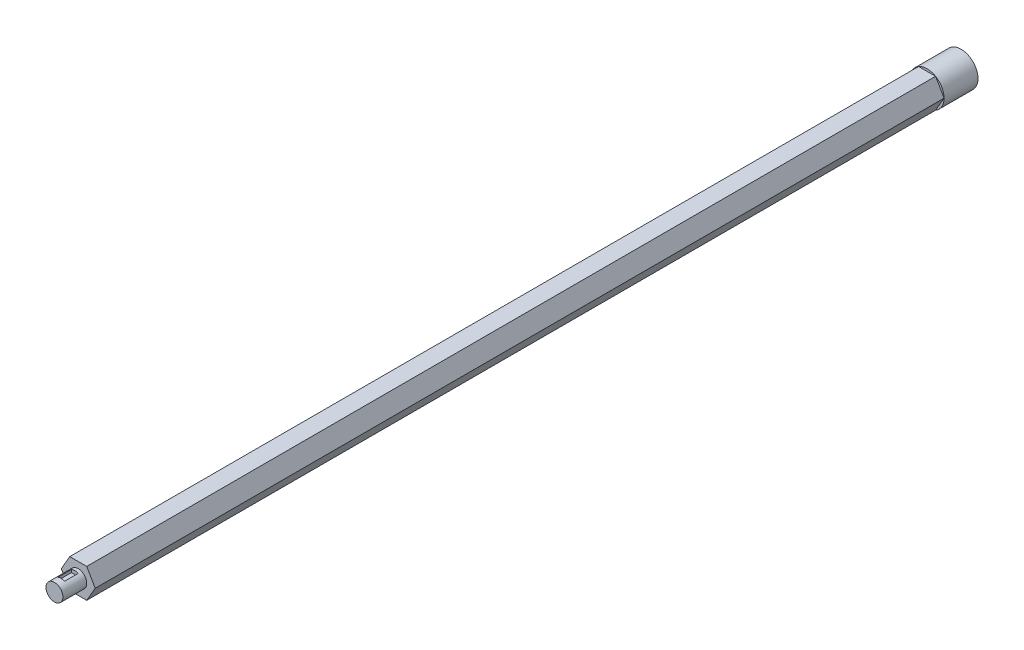
ISO-10303-21;
HEADER;
FILE_DESCRIPTION(('STEP AP214'),'2;1');
FILE_NAME('part.step','',(''),(''),'','','');
FILE_SCHEMA(('AUTOMOTIVE_DESIGN { 1 0 10303 214 1 1 1 1 }'));
ENDSEC;
DATA;
#1=APPLICATION_CONTEXT('core data for automotive mechanical design processes');
#2=APPLICATION_PROTOCOL_DEFINITION('international standard','automotive_design',2000,#1);
#3=PRODUCT_CONTEXT('',#1,'mechanical');
#4=PRODUCT('Part','Part','',(#3));
#5=PRODUCT_RELATED_PRODUCT_CATEGORY('part','',(#4));
#6=PRODUCT_DEFINITION_FORMATION('','',#4);
#7=PRODUCT_DEFINITION_CONTEXT('part definition',#1,'design');
#8=PRODUCT_DEFINITION('design','',#6,#7);
#9=PRODUCT_DEFINITION_SHAPE('','',#8);
#10=(LENGTH_UNIT() NAMED_UNIT(*) SI_UNIT(.MILLI.,.METRE.));
#11=(NAMED_UNIT(*) PLANE_ANGLE_UNIT() SI_UNIT($,.RADIAN.));
#12=(NAMED_UNIT(*) SI_UNIT($,.STERADIAN.) SOLID_ANGLE_UNIT());
#13=UNCERTAINTY_MEASURE_WITH_UNIT(LENGTH_MEASURE(1.E-05),#10,'distance_accuracy_value','');
#14=(GEOMETRIC_REPRESENTATION_CONTEXT(3) GLOBAL_UNCERTAINTY_ASSIGNED_CONTEXT((#13)) GLOBAL_UNIT_ASSIGNED_CONTEXT((#10,
#11,#12)) REPRESENTATION_CONTEXT('',''));
#15=CARTESIAN_POINT('',(0.,0.,0.));
#16=DIRECTION('',(0.,0.,1.));
#17=DIRECTION('',(1.,0.,0.));
#18=AXIS2_PLACEMENT_3D('',#15,#16,#17);
#19=CARTESIAN_POINT('',(0.,0.,250.));
#20=DIRECTION('',(0.,0.,1.));
#21=DIRECTION('',(1.,0.,0.));
#22=AXIS2_PLACEMENT_3D('',#19,#20,#21);
#23=PLANE('',#22);
#24=DIRECTION('',(0.5,0.866025403784439,0.));
#25=VECTOR('',#24,1.);
#26=CARTESIAN_POINT('',(2.5,-4.33012701892219,250.));
#27=LINE('',#26,#25);
#28=CARTESIAN_POINT('',(2.5,-4.33012701892219,250.));
#29=VERTEX_POINT('',#28);
#30=CARTESIAN_POINT('',(5.,0.,250.));
#31=VERTEX_POINT('',#30);
#32=EDGE_CURVE('E147',#29,#31,#27,.T.);
#33=ORIENTED_EDGE('',*,*,#32,.T.);
#34=DIRECTION('',(-0.5,0.866025403784439,0.));
#35=VECTOR('',#34,1.);
#36=CARTESIAN_POINT('',(5.,0.,250.));
#37=LINE('',#36,#35);
#38=CARTESIAN_POINT('',(2.5,4.33012701892219,250.));
#39=VERTEX_POINT('',#38);
#40=EDGE_CURVE('E150',#31,#39,#37,.T.);
#41=ORIENTED_EDGE('',*,*,#40,.T.);
#42=DIRECTION('',(-1.,0.,0.));
#43=VECTOR('',#42,1.);
#44=CARTESIAN_POINT('',(2.5,4.33012701892219,250.));
#45=LINE('',#44,#43);
#46=CARTESIAN_POINT('',(-2.5,4.33012701892219,250.));
#47=VERTEX_POINT('',#46);
#48=EDGE_CURVE('E153',#39,#47,#45,.T.);
#49=ORIENTED_EDGE('',*,*,#48,.T.);
#50=DIRECTION('',(-0.5,-0.866025403784439,0.));
#51=VECTOR('',#50,1.);
#52=CARTESIAN_POINT('',(-2.5,4.33012701892219,250.));
#53=LINE('',#52,#51);
#54=CARTESIAN_POINT('',(-5.,0.,250.));
#55=VERTEX_POINT('',#54);
#56=EDGE_CURVE('E155',#47,#55,#53,.T.);
#57=ORIENTED_EDGE('',*,*,#56,.T.);
#58=DIRECTION('',(0.5,-0.866025403784439,0.));
#59=VECTOR('',#58,1.);
#60=CARTESIAN_POINT('',(-5.,0.,250.));
#61=LINE('',#60,#59);
#62=CARTESIAN_POINT('',(-2.5,-4.33012701892219,250.));
#63=VERTEX_POINT('',#62);
#64=EDGE_CURVE('E157',#55,#63,#61,.T.);
#65=ORIENTED_EDGE('',*,*,#64,.T.);
#66=DIRECTION('',(1.,0.,0.));
#67=VECTOR('',#66,1.);
#68=CARTESIAN_POINT('',(-2.5,-4.33012701892219,250.));
#69=LINE('',#68,#67);
#70=EDGE_CURVE('E159',#63,#29,#69,.T.);
#71=ORIENTED_EDGE('',*,*,#70,.T.);
#72=EDGE_LOOP('',(#33,#41,#49,#57,#65,#71));
#73=FACE_BOUND('',#72,.T.);
#74=CARTESIAN_POINT('',(0.,0.,250.));
#75=DIRECTION('',(0.,0.,1.));
#76=DIRECTION('',(1.,0.,0.));
#77=AXIS2_PLACEMENT_3D('',#74,#75,#76);
#78=CIRCLE('',#77,2.5);
#79=CARTESIAN_POINT('',(2.5,0.,250.));
#80=VERTEX_POINT('',#79);
#81=EDGE_CURVE('E143',#80,#80,#78,.T.);
#82=ORIENTED_EDGE('',*,*,#81,.F.);
#83=EDGE_LOOP('',(#82));
#84=FACE_BOUND('',#83,.T.);
#85=ADVANCED_FACE('F33',(#73,#84),#23,.T.);
#86=CARTESIAN_POINT('',(0.,0.,260.));
#87=DIRECTION('',(0.,0.,-1.));
#88=DIRECTION('',(-1.,0.,0.));
#89=AXIS2_PLACEMENT_3D('',#86,#87,#88);
#90=CYLINDRICAL_SURFACE('',#89,2.5);
#91=DIRECTION('',(0.,0.,-1.));
#92=VECTOR('',#91,1.);
#93=CARTESIAN_POINT('',(-1.,2.29128784747792,260.));
#94=LINE('',#93,#92);
#95=CARTESIAN_POINT('',(-1.,2.29128784747792,255.));
#96=VERTEX_POINT('',#95);
#97=CARTESIAN_POINT('',(-1.,2.29128784747792,251.));
#98=VERTEX_POINT('',#97);
#99=EDGE_CURVE('E48',#96,#98,#94,.T.);
#100=ORIENTED_EDGE('',*,*,#99,.T.);
#101=CARTESIAN_POINT('',(0.,0.,251.));
#102=DIRECTION('',(0.,0.,1.));
#103=DIRECTION('',(1.,0.,0.));
#104=AXIS2_PLACEMENT_3D('',#101,#102,#103);
#105=CIRCLE('',#104,2.5);
#106=CARTESIAN_POINT('',(1.,2.29128784747792,251.));
#107=VERTEX_POINT('',#106);
#108=EDGE_CURVE('E115',#107,#98,#105,.T.);
#109=ORIENTED_EDGE('',*,*,#108,.F.);
#110=DIRECTION('',(0.,0.,-1.));
#111=VECTOR('',#110,1.);
#112=CARTESIAN_POINT('',(1.,2.29128784747792,260.));
#113=LINE('',#112,#111);
#114=CARTESIAN_POINT('',(1.,2.29128784747792,255.));
#115=VERTEX_POINT('',#114);
#116=EDGE_CURVE('E56',#107,#115,#113,.F.);
#117=ORIENTED_EDGE('',*,*,#116,.T.);
#118=CARTESIAN_POINT('',(0.,0.,255.));
#119=DIRECTION('',(0.,0.,1.));
#120=DIRECTION('',(1.,0.,0.));
#121=AXIS2_PLACEMENT_3D('',#118,#119,#120);
#122=CIRCLE('',#121,2.5);
#123=EDGE_CURVE('E203',#115,#96,#122,.T.);
#124=ORIENTED_EDGE('',*,*,#123,.T.);
#125=EDGE_LOOP('',(#100,#109,#117,#124));
#126=FACE_BOUND('',#125,.T.);
#127=CARTESIAN_POINT('',(0.,0.,257.));
#128=DIRECTION('',(0.,0.,1.));
#129=DIRECTION('',(1.,0.,0.));
#130=AXIS2_PLACEMENT_3D('',#127,#128,#129);
#131=CIRCLE('',#130,2.5);
#132=CARTESIAN_POINT('',(2.5,0.,257.));
#133=VERTEX_POINT('',#132);
#134=EDGE_CURVE('E207',#133,#133,#131,.T.);
#135=ORIENTED_EDGE('',*,*,#134,.F.);
#136=EDGE_LOOP('',(#135));
#137=FACE_BOUND('',#136,.T.);
#138=ORIENTED_EDGE('',*,*,#81,.T.);
#139=EDGE_LOOP('',(#138));
#140=FACE_BOUND('',#139,.T.);
#141=ADVANCED_FACE('F120',(#126,#137,#140),#90,.T.);
#142=CARTESIAN_POINT('',(-1.,3.33557361442027,250.));
#143=DIRECTION('',(-1.,0.,0.));
#144=DIRECTION('',(0.,-1.,0.));
#145=AXIS2_PLACEMENT_3D('',#142,#143,#144);
#146=PLANE('',#145);
#147=DIRECTION('',(0.,0.,1.));
#148=VECTOR('',#147,1.);
#149=CARTESIAN_POINT('',(-1.,1.5,250.));
#150=LINE('',#149,#148);
#151=CARTESIAN_POINT('',(-1.,1.5,251.));
#152=VERTEX_POINT('',#151);
#153=CARTESIAN_POINT('',(-1.,1.5,255.));
#154=VERTEX_POINT('',#153);
#155=EDGE_CURVE('E131',#152,#154,#150,.T.);
#156=ORIENTED_EDGE('',*,*,#155,.F.);
#157=DIRECTION('',(0.,1.,0.));
#158=VECTOR('',#157,1.);
#159=CARTESIAN_POINT('',(-1.,3.33557361442027,251.));
#160=LINE('',#159,#158);
#161=EDGE_CURVE('E118',#152,#98,#160,.T.);
#162=ORIENTED_EDGE('',*,*,#161,.T.);
#163=ORIENTED_EDGE('',*,*,#99,.F.);
#164=DIRECTION('',(0.,1.,0.));
#165=VECTOR('',#164,1.);
#166=CARTESIAN_POINT('',(-1.,3.33557361442027,255.));
#167=LINE('',#166,#165);
#168=EDGE_CURVE('E197',#154,#96,#167,.T.);
#169=ORIENTED_EDGE('',*,*,#168,.F.);
#170=EDGE_LOOP('',(#156,#162,#163,#169));
#171=FACE_BOUND('',#170,.T.);
#172=ADVANCED_FACE('F201',(#171),#146,.F.);
#173=CARTESIAN_POINT('',(1.,3.33557361442027,250.));
#174=DIRECTION('',(1.,0.,0.));
#175=DIRECTION('',(0.,1.,0.));
#176=AXIS2_PLACEMENT_3D('',#173,#174,#175);
#177=PLANE('',#176);
#178=ORIENTED_EDGE('',*,*,#116,.F.);
#179=DIRECTION('',(0.,-1.,0.));
#180=VECTOR('',#179,1.);
#181=CARTESIAN_POINT('',(1.,3.33557361442027,251.));
#182=LINE('',#181,#180);
#183=CARTESIAN_POINT('',(1.,1.5,251.));
#184=VERTEX_POINT('',#183);
#185=EDGE_CURVE('E113',#107,#184,#182,.T.);
#186=ORIENTED_EDGE('',*,*,#185,.T.);
#187=DIRECTION('',(0.,0.,1.));
#188=VECTOR('',#187,1.);
#189=CARTESIAN_POINT('',(1.,1.5,250.));
#190=LINE('',#189,#188);
#191=CARTESIAN_POINT('',(1.,1.5,255.));
#192=VERTEX_POINT('',#191);
#193=EDGE_CURVE('E127',#184,#192,#190,.T.);
#194=ORIENTED_EDGE('',*,*,#193,.T.);
#195=DIRECTION('',(0.,-1.,0.));
#196=VECTOR('',#195,1.);
#197=CARTESIAN_POINT('',(1.,3.33557361442027,255.));
#198=LINE('',#197,#196);
#199=EDGE_CURVE('E125',#115,#192,#198,.T.);
#200=ORIENTED_EDGE('',*,*,#199,.F.);
#201=EDGE_LOOP('',(#178,#186,#194,#200));
#202=FACE_BOUND('',#201,.T.);
#203=ADVANCED_FACE('F123',(#202),#177,.F.);
#204=CARTESIAN_POINT('',(-1.,1.5,250.));
#205=DIRECTION('',(0.,-1.,0.));
#206=DIRECTION('',(0.,0.,-1.));
#207=AXIS2_PLACEMENT_3D('',#204,#205,#206);
#208=PLANE('',#207);
#209=ORIENTED_EDGE('',*,*,#193,.F.);
#210=DIRECTION('',(-1.,0.,0.));
#211=VECTOR('',#210,1.);
#212=CARTESIAN_POINT('',(-1.,1.5,251.));
#213=LINE('',#212,#211);
#214=EDGE_CURVE('E11',#184,#152,#213,.T.);
#215=ORIENTED_EDGE('',*,*,#214,.T.);
#216=ORIENTED_EDGE('',*,*,#155,.T.);
#217=DIRECTION('',(-1.,0.,0.));
#218=VECTOR('',#217,1.);
#219=CARTESIAN_POINT('',(-1.,1.5,255.));
#220=LINE('',#219,#218);
#221=EDGE_CURVE('E41',#192,#154,#220,.T.);
#222=ORIENTED_EDGE('',*,*,#221,.F.);
#223=EDGE_LOOP('',(#209,#215,#216,#222));
#224=FACE_BOUND('',#223,.T.);
#225=ADVANCED_FACE('F199',(#224),#208,.F.);
#226=CARTESIAN_POINT('',(2.5,-4.33012701892219,250.));
#227=DIRECTION('',(-0.866025403784439,0.5,0.));
#228=DIRECTION('',(-0.5,-0.866025403784439,0.));
#229=AXIS2_PLACEMENT_3D('',#226,#227,#228);
#230=PLANE('',#229);
#231=DIRECTION('',(0.5,0.866025403784439,0.));
#232=VECTOR('',#231,1.);
#233=CARTESIAN_POINT('',(2.5,-4.33012701892219,0.));
#234=LINE('',#233,#232);
#235=CARTESIAN_POINT('',(2.50000000000001,-4.33012701892219,0.));
#236=VERTEX_POINT('',#235);
#237=CARTESIAN_POINT('',(5.,0.,0.));
#238=VERTEX_POINT('',#237);
#239=EDGE_CURVE('E138',#236,#238,#234,.T.);
#240=ORIENTED_EDGE('',*,*,#239,.T.);
#241=DIRECTION('',(0.,0.,-1.));
#242=VECTOR('',#241,1.);
#243=CARTESIAN_POINT('',(5.,0.,250.));
#244=LINE('',#243,#242);
#245=EDGE_CURVE('E146',#31,#238,#244,.T.);
#246=ORIENTED_EDGE('',*,*,#245,.F.);
#247=ORIENTED_EDGE('',*,*,#32,.F.);
#248=DIRECTION('',(0.,0.,-1.));
#249=VECTOR('',#248,1.);
#250=CARTESIAN_POINT('',(2.5,-4.33012701892219,250.));
#251=LINE('',#250,#249);
#252=EDGE_CURVE('E161',#29,#236,#251,.T.);
#253=ORIENTED_EDGE('',*,*,#252,.T.);
#254=EDGE_LOOP('',(#240,#246,#247,#253));
#255=FACE_BOUND('',#254,.T.);
#256=ADVANCED_FACE('F35',(#255),#230,.F.);
#257=CARTESIAN_POINT('',(5.,0.,250.));
#258=DIRECTION('',(-0.866025403784439,-0.5,0.));
#259=DIRECTION('',(0.5,-0.866025403784439,0.));
#260=AXIS2_PLACEMENT_3D('',#257,#258,#259);
#261=PLANE('',#260);
#262=DIRECTION('',(-0.5,0.866025403784439,0.));
#263=VECTOR('',#262,1.);
#264=CARTESIAN_POINT('',(5.,0.,0.));
#265=LINE('',#264,#263);
#266=CARTESIAN_POINT('',(2.5,4.33012701892219,0.));
#267=VERTEX_POINT('',#266);
#268=EDGE_CURVE('E164',#238,#267,#265,.T.);
#269=ORIENTED_EDGE('',*,*,#268,.T.);
#270=DIRECTION('',(0.,0.,-1.));
#271=VECTOR('',#270,1.);
#272=CARTESIAN_POINT('',(2.5,4.33012701892219,250.));
#273=LINE('',#272,#271);
#274=EDGE_CURVE('E189',#39,#267,#273,.T.);
#275=ORIENTED_EDGE('',*,*,#274,.F.);
#276=ORIENTED_EDGE('',*,*,#40,.F.);
#277=ORIENTED_EDGE('',*,*,#245,.T.);
#278=EDGE_LOOP('',(#269,#275,#276,#277));
#279=FACE_BOUND('',#278,.T.);
#280=ADVANCED_FACE('F240',(#279),#261,.F.);
#281=CARTESIAN_POINT('',(2.5,4.33012701892219,250.));
#282=DIRECTION('',(0.,-1.,0.));
#283=DIRECTION('',(1.,0.,0.));
#284=AXIS2_PLACEMENT_3D('',#281,#282,#283);
#285=PLANE('',#284);
#286=DIRECTION('',(-1.,0.,0.));
#287=VECTOR('',#286,1.);
#288=CARTESIAN_POINT('',(2.5,4.33012701892219,0.));
#289=LINE('',#288,#287);
#290=CARTESIAN_POINT('',(-2.5,4.33012701892219,0.));
#291=VERTEX_POINT('',#290);
#292=EDGE_CURVE('E167',#267,#291,#289,.T.);
#293=ORIENTED_EDGE('',*,*,#292,.T.);
#294=DIRECTION('',(0.,0.,-1.));
#295=VECTOR('',#294,1.);
#296=CARTESIAN_POINT('',(-2.5,4.33012701892219,250.));
#297=LINE('',#296,#295);
#298=EDGE_CURVE('E186',#47,#291,#297,.T.);
#299=ORIENTED_EDGE('',*,*,#298,.F.);
#300=ORIENTED_EDGE('',*,*,#48,.F.);
#301=ORIENTED_EDGE('',*,*,#274,.T.);
#302=EDGE_LOOP('',(#293,#299,#300,#301));
#303=FACE_BOUND('',#302,.T.);
#304=ADVANCED_FACE('F237',(#303),#285,.F.);
#305=CARTESIAN_POINT('',(-2.5,4.33012701892219,250.));
#306=DIRECTION('',(0.866025403784439,-0.5,0.));
#307=DIRECTION('',(0.5,0.866025403784439,0.));
#308=AXIS2_PLACEMENT_3D('',#305,#306,#307);
#309=PLANE('',#308);
#310=DIRECTION('',(-0.5,-0.866025403784439,0.));
#311=VECTOR('',#310,1.);
#312=CARTESIAN_POINT('',(-2.5,4.33012701892219,0.));
#313=LINE('',#312,#311);
#314=CARTESIAN_POINT('',(-5.,0.,0.));
#315=VERTEX_POINT('',#314);
#316=EDGE_CURVE('E170',#291,#315,#313,.T.);
#317=ORIENTED_EDGE('',*,*,#316,.T.);
#318=DIRECTION('',(0.,0.,-1.));
#319=VECTOR('',#318,1.);
#320=CARTESIAN_POINT('',(-5.,0.,250.));
#321=LINE('',#320,#319);
#322=EDGE_CURVE('E183',#55,#315,#321,.T.);
#323=ORIENTED_EDGE('',*,*,#322,.F.);
#324=ORIENTED_EDGE('',*,*,#56,.F.);
#325=ORIENTED_EDGE('',*,*,#298,.T.);
#326=EDGE_LOOP('',(#317,#323,#324,#325));
#327=FACE_BOUND('',#326,.T.);
#328=ADVANCED_FACE('F233',(#327),#309,.F.);
#329=CARTESIAN_POINT('',(-5.,0.,250.));
#330=DIRECTION('',(0.866025403784439,0.5,0.));
#331=DIRECTION('',(-0.5,0.866025403784439,0.));
#332=AXIS2_PLACEMENT_3D('',#329,#330,#331);
#333=PLANE('',#332);
#334=DIRECTION('',(0.5,-0.866025403784439,0.));
#335=VECTOR('',#334,1.);
#336=CARTESIAN_POINT('',(-5.,0.,0.));
#337=LINE('',#336,#335);
#338=CARTESIAN_POINT('',(-2.50000000000001,-4.33012701892219,0.));
#339=VERTEX_POINT('',#338);
#340=EDGE_CURVE('E173',#315,#339,#337,.T.);
#341=ORIENTED_EDGE('',*,*,#340,.T.);
#342=DIRECTION('',(0.,0.,-1.));
#343=VECTOR('',#342,1.);
#344=CARTESIAN_POINT('',(-2.5,-4.33012701892219,250.));
#345=LINE('',#344,#343);
#346=EDGE_CURVE('E180',#63,#339,#345,.T.);
#347=ORIENTED_EDGE('',*,*,#346,.F.);
#348=ORIENTED_EDGE('',*,*,#64,.F.);
#349=ORIENTED_EDGE('',*,*,#322,.T.);
#350=EDGE_LOOP('',(#341,#347,#348,#349));
#351=FACE_BOUND('',#350,.T.);
#352=ADVANCED_FACE('F229',(#351),#333,.F.);
#353=CARTESIAN_POINT('',(-2.5,-4.33012701892219,250.));
#354=DIRECTION('',(0.,1.,0.));
#355=DIRECTION('',(-1.,0.,0.));
#356=AXIS2_PLACEMENT_3D('',#353,#354,#355);
#357=PLANE('',#356);
#358=DIRECTION('',(1.,0.,0.));
#359=VECTOR('',#358,1.);
#360=CARTESIAN_POINT('',(-2.5,-4.33012701892219,0.));
#361=LINE('',#360,#359);
#362=EDGE_CURVE('E151',#339,#236,#361,.T.);
#363=ORIENTED_EDGE('',*,*,#362,.T.);
#364=ORIENTED_EDGE('',*,*,#252,.F.);
#365=ORIENTED_EDGE('',*,*,#70,.F.);
#366=ORIENTED_EDGE('',*,*,#346,.T.);
#367=EDGE_LOOP('',(#363,#364,#365,#366));
#368=FACE_BOUND('',#367,.T.);
#369=ADVANCED_FACE('F225',(#368),#357,.F.);
#370=CARTESIAN_POINT('',(0.,0.,0.));
#371=DIRECTION('',(0.,0.,-1.));
#372=DIRECTION('',(-1.,0.,0.));
#373=AXIS2_PLACEMENT_3D('',#370,#371,#372);
#374=PLANE('',#373);
#375=ORIENTED_EDGE('',*,*,#239,.F.);
#376=CARTESIAN_POINT('',(0.,0.,0.));
#377=DIRECTION('',(0.,0.,-1.));
#378=DIRECTION('',(-1.,0.,0.));
#379=AXIS2_PLACEMENT_3D('',#376,#377,#378);
#380=CIRCLE('',#379,5.);
#381=EDGE_CURVE('E264',#238,#236,#380,.T.);
#382=ORIENTED_EDGE('',*,*,#381,.F.);
#383=EDGE_LOOP('',(#375,#382));
#384=FACE_BOUND('',#383,.T.);
#385=ADVANCED_FACE('F228',(#384),#374,.F.);
#386=ORIENTED_EDGE('',*,*,#362,.F.);
#387=EDGE_CURVE('E268',#236,#339,#380,.T.);
#388=ORIENTED_EDGE('',*,*,#387,.F.);
#389=EDGE_LOOP('',(#386,#388));
#390=FACE_BOUND('',#389,.T.);
#391=ADVANCED_FACE('F269',(#390),#374,.F.);
#392=ORIENTED_EDGE('',*,*,#340,.F.);
#393=EDGE_CURVE('E129',#339,#315,#380,.T.);
#394=ORIENTED_EDGE('',*,*,#393,.F.);
#395=EDGE_LOOP('',(#392,#394));
#396=FACE_BOUND('',#395,.T.);
#397=ADVANCED_FACE('F278',(#396),#374,.F.);
#398=ORIENTED_EDGE('',*,*,#316,.F.);
#399=EDGE_CURVE('E139',#315,#291,#380,.T.);
#400=ORIENTED_EDGE('',*,*,#399,.F.);
#401=EDGE_LOOP('',(#398,#400));
#402=FACE_BOUND('',#401,.T.);
#403=ADVANCED_FACE('F281',(#402),#374,.F.);
#404=ORIENTED_EDGE('',*,*,#292,.F.);
#405=EDGE_CURVE('E142',#291,#267,#380,.T.);
#406=ORIENTED_EDGE('',*,*,#405,.F.);
#407=EDGE_LOOP('',(#404,#406));
#408=FACE_BOUND('',#407,.T.);
#409=ADVANCED_FACE('F284',(#408),#374,.F.);
#410=ORIENTED_EDGE('',*,*,#268,.F.);
#411=EDGE_CURVE('E274',#267,#238,#380,.T.);
#412=ORIENTED_EDGE('',*,*,#411,.F.);
#413=EDGE_LOOP('',(#410,#412));
#414=FACE_BOUND('',#413,.T.);
#415=ADVANCED_FACE('F285',(#414),#374,.F.);
#416=CARTESIAN_POINT('',(0.,0.,-10.));
#417=DIRECTION('',(0.,0.,1.));
#418=DIRECTION('',(1.,0.,0.));
#419=AXIS2_PLACEMENT_3D('',#416,#417,#418);
#420=CYLINDRICAL_SURFACE('',#419,5.);
#421=CARTESIAN_POINT('',(0.,0.,-10.));
#422=DIRECTION('',(0.,0.,-1.));
#423=DIRECTION('',(-1.,0.,0.));
#424=AXIS2_PLACEMENT_3D('',#421,#422,#423);
#425=CIRCLE('',#424,5.);
#426=CARTESIAN_POINT('',(-5.,0.,-10.));
#427=VERTEX_POINT('',#426);
#428=EDGE_CURVE('E135',#427,#427,#425,.T.);
#429=ORIENTED_EDGE('',*,*,#428,.F.);
#430=EDGE_LOOP('',(#429));
#431=FACE_BOUND('',#430,.T.);
#432=ORIENTED_EDGE('',*,*,#399,.T.);
#433=ORIENTED_EDGE('',*,*,#405,.T.);
#434=ORIENTED_EDGE('',*,*,#411,.T.);
#435=ORIENTED_EDGE('',*,*,#381,.T.);
#436=ORIENTED_EDGE('',*,*,#387,.T.);
#437=ORIENTED_EDGE('',*,*,#393,.T.);
#438=EDGE_LOOP('',(#432,#433,#434,#435,#436,#437));
#439=FACE_BOUND('',#438,.T.);
#440=ADVANCED_FACE('F273',(#431,#439),#420,.T.);
#441=CARTESIAN_POINT('',(0.,0.,-10.));
#442=DIRECTION('',(0.,0.,-1.));
#443=DIRECTION('',(-1.,0.,0.));
#444=AXIS2_PLACEMENT_3D('',#441,#442,#443);
#445=PLANE('',#444);
#446=ORIENTED_EDGE('',*,*,#428,.T.);
#447=EDGE_LOOP('',(#446));
#448=FACE_BOUND('',#447,.T.);
#449=ADVANCED_FACE('F292',(#448),#445,.T.);
#450=CARTESIAN_POINT('',(0.,0.,255.));
#451=DIRECTION('',(0.,0.,1.));
#452=DIRECTION('',(1.,0.,0.));
#453=AXIS2_PLACEMENT_3D('',#450,#451,#452);
#454=PLANE('',#453);
#455=ORIENTED_EDGE('',*,*,#221,.T.);
#456=ORIENTED_EDGE('',*,*,#168,.T.);
#457=ORIENTED_EDGE('',*,*,#123,.F.);
#458=ORIENTED_EDGE('',*,*,#199,.T.);
#459=EDGE_LOOP('',(#455,#456,#457,#458));
#460=FACE_BOUND('',#459,.T.);
#461=ADVANCED_FACE('F196',(#460),#454,.F.);
#462=CARTESIAN_POINT('',(0.,0.,257.));
#463=DIRECTION('',(0.,0.,1.));
#464=DIRECTION('',(1.,0.,0.));
#465=AXIS2_PLACEMENT_3D('',#462,#463,#464);
#466=PLANE('',#465);
#467=ORIENTED_EDGE('',*,*,#134,.T.);
#468=EDGE_LOOP('',(#467));
#469=FACE_BOUND('',#468,.T.);
#470=ADVANCED_FACE('F212',(#469),#466,.T.);
#471=CARTESIAN_POINT('',(0.,0.,251.));
#472=DIRECTION('',(0.,0.,1.));
#473=DIRECTION('',(1.,0.,0.));
#474=AXIS2_PLACEMENT_3D('',#471,#472,#473);
#475=PLANE('',#474);
#476=ORIENTED_EDGE('',*,*,#161,.F.);
#477=ORIENTED_EDGE('',*,*,#214,.F.);
#478=ORIENTED_EDGE('',*,*,#185,.F.);
#479=ORIENTED_EDGE('',*,*,#108,.T.);
#480=EDGE_LOOP('',(#476,#477,#478,#479));
#481=FACE_BOUND('',#480,.T.);
#482=ADVANCED_FACE('F114',(#481),#475,.T.);
#483=CLOSED_SHELL('',(#85,#141,#172,#203,#225,#256,#280,#304,#328,#352,#369,#385,#391,#397,#403,
#409,#415,#440,#449,#461,#470,#482));
#484=MANIFOLD_SOLID_BREP('B2',#483);
#485=ADVANCED_BREP_SHAPE_REPRESENTATION('',(#18,#484),#14);
#486=SHAPE_DEFINITION_REPRESENTATION(#9,#485);
ENDSEC;
END-ISO-10303-21;
